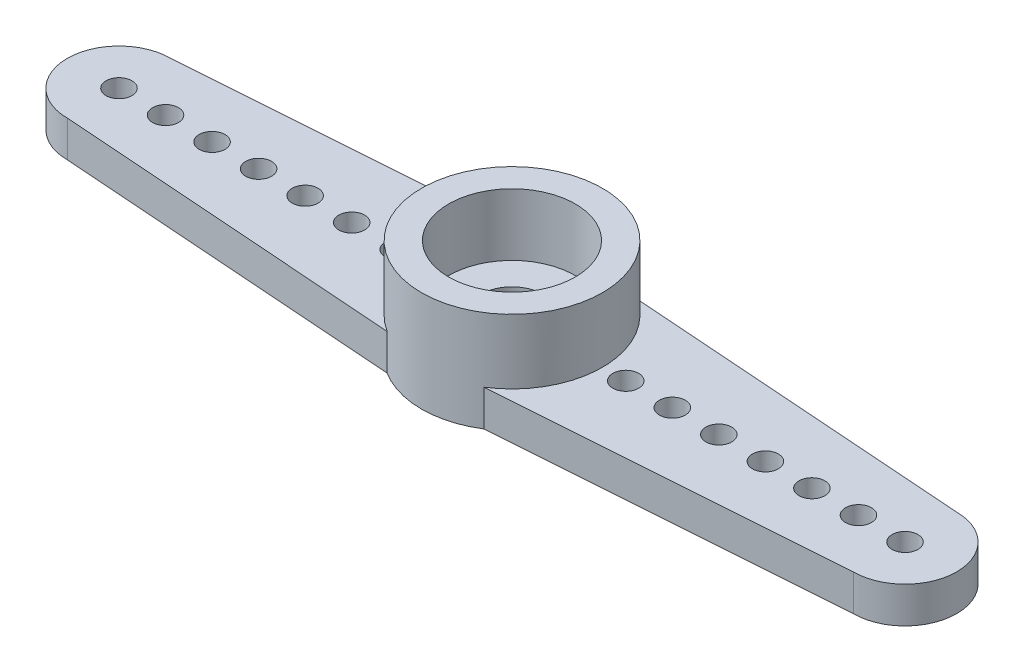
ISO-10303-21;
HEADER;
FILE_DESCRIPTION(('STEP AP214'),'2;1');
FILE_NAME('part.step','',(''),(''),'','','');
FILE_SCHEMA(('AUTOMOTIVE_DESIGN { 1 0 10303 214 1 1 1 1 }'));
ENDSEC;
DATA;
#1=APPLICATION_CONTEXT('core data for automotive mechanical design processes');
#2=APPLICATION_PROTOCOL_DEFINITION('international standard','automotive_design',2000,#1);
#3=PRODUCT_CONTEXT('',#1,'mechanical');
#4=PRODUCT('Part','Part','',(#3));
#5=PRODUCT_RELATED_PRODUCT_CATEGORY('part','',(#4));
#6=PRODUCT_DEFINITION_FORMATION('','',#4);
#7=PRODUCT_DEFINITION_CONTEXT('part definition',#1,'design');
#8=PRODUCT_DEFINITION('design','',#6,#7);
#9=PRODUCT_DEFINITION_SHAPE('','',#8);
#10=(LENGTH_UNIT() NAMED_UNIT(*) SI_UNIT(.MILLI.,.METRE.));
#11=(NAMED_UNIT(*) PLANE_ANGLE_UNIT() SI_UNIT($,.RADIAN.));
#12=(NAMED_UNIT(*) SI_UNIT($,.STERADIAN.) SOLID_ANGLE_UNIT());
#13=UNCERTAINTY_MEASURE_WITH_UNIT(LENGTH_MEASURE(1.E-05),#10,'distance_accuracy_value','');
#14=(GEOMETRIC_REPRESENTATION_CONTEXT(3) GLOBAL_UNCERTAINTY_ASSIGNED_CONTEXT((#13)) GLOBAL_UNIT_ASSIGNED_CONTEXT((#10,
#11,#12)) REPRESENTATION_CONTEXT('',''));
#15=CARTESIAN_POINT('',(0.,0.,0.));
#16=DIRECTION('',(0.,0.,1.));
#17=DIRECTION('',(1.,0.,0.));
#18=AXIS2_PLACEMENT_3D('',#15,#16,#17);
#19=CARTESIAN_POINT('',(-15.2,1.4,0.));
#20=DIRECTION('',(0.,1.,0.));
#21=DIRECTION('',(0.,0.,1.));
#22=AXIS2_PLACEMENT_3D('',#19,#20,#21);
#23=PLANE('',#22);
#24=CARTESIAN_POINT('',(-6.2,1.4,0.));
#25=DIRECTION('',(0.,1.,0.));
#26=DIRECTION('',(0.,0.,1.));
#27=AXIS2_PLACEMENT_3D('',#24,#25,#26);
#28=CIRCLE('',#27,0.500000000000001);
#29=CARTESIAN_POINT('',(-6.2,1.4,0.500000000000001));
#30=VERTEX_POINT('',#29);
#31=EDGE_CURVE('E185',#30,#30,#28,.T.);
#32=ORIENTED_EDGE('',*,*,#31,.F.);
#33=EDGE_LOOP('',(#32));
#34=FACE_BOUND('',#33,.T.);
#35=CARTESIAN_POINT('',(-9.8,1.4,0.));
#36=DIRECTION('',(0.,1.,0.));
#37=DIRECTION('',(0.,0.,1.));
#38=AXIS2_PLACEMENT_3D('',#35,#36,#37);
#39=CIRCLE('',#38,0.500000000000001);
#40=CARTESIAN_POINT('',(-9.8,1.4,0.500000000000001));
#41=VERTEX_POINT('',#40);
#42=EDGE_CURVE('E197',#41,#41,#39,.T.);
#43=ORIENTED_EDGE('',*,*,#42,.F.);
#44=EDGE_LOOP('',(#43));
#45=FACE_BOUND('',#44,.T.);
#46=CARTESIAN_POINT('',(-11.6,1.4,0.));
#47=DIRECTION('',(0.,1.,0.));
#48=DIRECTION('',(0.,0.,1.));
#49=AXIS2_PLACEMENT_3D('',#46,#47,#48);
#50=CIRCLE('',#49,0.499999999999999);
#51=CARTESIAN_POINT('',(-11.6,1.4,0.499999999999999));
#52=VERTEX_POINT('',#51);
#53=EDGE_CURVE('E203',#52,#52,#50,.T.);
#54=ORIENTED_EDGE('',*,*,#53,.F.);
#55=EDGE_LOOP('',(#54));
#56=FACE_BOUND('',#55,.T.);
#57=CARTESIAN_POINT('',(-13.4,1.4,0.));
#58=DIRECTION('',(0.,1.,0.));
#59=DIRECTION('',(0.,0.,1.));
#60=AXIS2_PLACEMENT_3D('',#57,#58,#59);
#61=CIRCLE('',#60,0.500000000000001);
#62=CARTESIAN_POINT('',(-13.4,1.4,0.500000000000001));
#63=VERTEX_POINT('',#62);
#64=EDGE_CURVE('E209',#63,#63,#61,.T.);
#65=ORIENTED_EDGE('',*,*,#64,.F.);
#66=EDGE_LOOP('',(#65));
#67=FACE_BOUND('',#66,.T.);
#68=CARTESIAN_POINT('',(-15.2,1.4,0.));
#69=DIRECTION('',(0.,1.,0.));
#70=DIRECTION('',(0.,0.,1.));
#71=AXIS2_PLACEMENT_3D('',#68,#69,#70);
#72=CIRCLE('',#71,0.500000000000001);
#73=CARTESIAN_POINT('',(-15.2,1.4,0.500000000000001));
#74=VERTEX_POINT('',#73);
#75=EDGE_CURVE('E96',#74,#74,#72,.T.);
#76=ORIENTED_EDGE('',*,*,#75,.F.);
#77=EDGE_LOOP('',(#76));
#78=FACE_BOUND('',#77,.T.);
#79=CARTESIAN_POINT('',(-8.,1.4,0.));
#80=DIRECTION('',(0.,1.,0.));
#81=DIRECTION('',(0.,0.,1.));
#82=AXIS2_PLACEMENT_3D('',#79,#80,#81);
#83=CIRCLE('',#82,0.500000000000001);
#84=CARTESIAN_POINT('',(-8.,1.4,0.500000000000001));
#85=VERTEX_POINT('',#84);
#86=EDGE_CURVE('E191',#85,#85,#83,.T.);
#87=ORIENTED_EDGE('',*,*,#86,.F.);
#88=EDGE_LOOP('',(#87));
#89=FACE_BOUND('',#88,.T.);
#90=CARTESIAN_POINT('',(-4.4,1.4,0.));
#91=DIRECTION('',(0.,1.,0.));
#92=DIRECTION('',(0.,0.,1.));
#93=AXIS2_PLACEMENT_3D('',#90,#91,#92);
#94=CIRCLE('',#93,0.500000000000001);
#95=CARTESIAN_POINT('',(-4.4,1.4,0.500000000000001));
#96=VERTEX_POINT('',#95);
#97=EDGE_CURVE('E179',#96,#96,#94,.T.);
#98=ORIENTED_EDGE('',*,*,#97,.F.);
#99=EDGE_LOOP('',(#98));
#100=FACE_BOUND('',#99,.T.);
#101=DIRECTION('',(0.997420198870011,0.,0.0717840294641297));
#102=VECTOR('',#101,1.);
#103=CARTESIAN_POINT('',(-15.2,1.4,2.));
#104=LINE('',#103,#102);
#105=CARTESIAN_POINT('',(-15.2,1.4,2.));
#106=VERTEX_POINT('',#105);
#107=CARTESIAN_POINT('',(-1.86858471289894,1.4,2.95945791838985));
#108=VERTEX_POINT('',#107);
#109=EDGE_CURVE('E223',#106,#108,#104,.T.);
#110=ORIENTED_EDGE('',*,*,#109,.T.);
#111=CARTESIAN_POINT('',(0.,1.4,0.));
#112=DIRECTION('',(0.,1.,0.));
#113=DIRECTION('',(0.,0.,1.));
#114=AXIS2_PLACEMENT_3D('',#111,#112,#113);
#115=CIRCLE('',#114,3.5);
#116=CARTESIAN_POINT('',(-1.86858471289894,1.4,-2.95945791838985));
#117=VERTEX_POINT('',#116);
#118=EDGE_CURVE('E118',#117,#108,#115,.T.);
#119=ORIENTED_EDGE('',*,*,#118,.F.);
#120=DIRECTION('',(-0.997420198870011,0.,0.0717840294641296));
#121=VECTOR('',#120,1.);
#122=CARTESIAN_POINT('',(-15.2,1.4,-2.));
#123=LINE('',#122,#121);
#124=CARTESIAN_POINT('',(-15.2,1.4,-2.));
#125=VERTEX_POINT('',#124);
#126=EDGE_CURVE('E49',#117,#125,#123,.T.);
#127=ORIENTED_EDGE('',*,*,#126,.T.);
#128=CARTESIAN_POINT('',(-15.2,1.4,0.));
#129=DIRECTION('',(0.,1.,0.));
#130=DIRECTION('',(0.,0.,1.));
#131=AXIS2_PLACEMENT_3D('',#128,#129,#130);
#132=CIRCLE('',#131,2.);
#133=EDGE_CURVE('E82',#125,#106,#132,.T.);
#134=ORIENTED_EDGE('',*,*,#133,.T.);
#135=EDGE_LOOP('',(#110,#119,#127,#134));
#136=FACE_BOUND('',#135,.T.);
#137=ADVANCED_FACE('F32',(#34,#45,#56,#67,#78,#89,#100,#136),#23,.T.);
#138=CARTESIAN_POINT('',(6.2,1.4,0.));
#139=DIRECTION('',(0.,1.,0.));
#140=DIRECTION('',(0.,0.,1.));
#141=AXIS2_PLACEMENT_3D('',#138,#139,#140);
#142=CIRCLE('',#141,0.499999999999997);
#143=CARTESIAN_POINT('',(6.2,1.4,0.500000000000053));
#144=VERTEX_POINT('',#143);
#145=EDGE_CURVE('E149',#144,#144,#142,.T.);
#146=ORIENTED_EDGE('',*,*,#145,.F.);
#147=EDGE_LOOP('',(#146));
#148=FACE_BOUND('',#147,.T.);
#149=CARTESIAN_POINT('',(9.8,1.4,0.));
#150=DIRECTION('',(0.,1.,0.));
#151=DIRECTION('',(0.,0.,1.));
#152=AXIS2_PLACEMENT_3D('',#149,#150,#151);
#153=CIRCLE('',#152,0.499999999999997);
#154=CARTESIAN_POINT('',(9.8,1.4,0.500000000000028));
#155=VERTEX_POINT('',#154);
#156=EDGE_CURVE('E161',#155,#155,#153,.T.);
#157=ORIENTED_EDGE('',*,*,#156,.F.);
#158=EDGE_LOOP('',(#157));
#159=FACE_BOUND('',#158,.T.);
#160=CARTESIAN_POINT('',(13.4,1.4,0.));
#161=DIRECTION('',(0.,1.,0.));
#162=DIRECTION('',(0.,0.,1.));
#163=AXIS2_PLACEMENT_3D('',#160,#161,#162);
#164=CIRCLE('',#163,0.499999999999997);
#165=CARTESIAN_POINT('',(13.4,1.4,0.500000000000003));
#166=VERTEX_POINT('',#165);
#167=EDGE_CURVE('E173',#166,#166,#164,.T.);
#168=ORIENTED_EDGE('',*,*,#167,.F.);
#169=EDGE_LOOP('',(#168));
#170=FACE_BOUND('',#169,.T.);
#171=CARTESIAN_POINT('',(15.2,1.4,0.));
#172=DIRECTION('',(0.,1.,0.));
#173=DIRECTION('',(0.,0.,1.));
#174=AXIS2_PLACEMENT_3D('',#171,#172,#173);
#175=CIRCLE('',#174,0.499999999999997);
#176=CARTESIAN_POINT('',(15.2,1.4,0.49999999999999));
#177=VERTEX_POINT('',#176);
#178=EDGE_CURVE('E215',#177,#177,#175,.T.);
#179=ORIENTED_EDGE('',*,*,#178,.F.);
#180=EDGE_LOOP('',(#179));
#181=FACE_BOUND('',#180,.T.);
#182=CARTESIAN_POINT('',(11.6,1.4,0.));
#183=DIRECTION('',(0.,1.,0.));
#184=DIRECTION('',(0.,0.,1.));
#185=AXIS2_PLACEMENT_3D('',#182,#183,#184);
#186=CIRCLE('',#185,0.499999999999999);
#187=CARTESIAN_POINT('',(11.6,1.4,0.500000000000017));
#188=VERTEX_POINT('',#187);
#189=EDGE_CURVE('E167',#188,#188,#186,.T.);
#190=ORIENTED_EDGE('',*,*,#189,.F.);
#191=EDGE_LOOP('',(#190));
#192=FACE_BOUND('',#191,.T.);
#193=CARTESIAN_POINT('',(8.,1.4,0.));
#194=DIRECTION('',(0.,1.,0.));
#195=DIRECTION('',(0.,0.,1.));
#196=AXIS2_PLACEMENT_3D('',#193,#194,#195);
#197=CIRCLE('',#196,0.499999999999997);
#198=CARTESIAN_POINT('',(8.,1.4,0.500000000000041));
#199=VERTEX_POINT('',#198);
#200=EDGE_CURVE('E155',#199,#199,#197,.T.);
#201=ORIENTED_EDGE('',*,*,#200,.F.);
#202=EDGE_LOOP('',(#201));
#203=FACE_BOUND('',#202,.T.);
#204=CARTESIAN_POINT('',(4.4,1.4,0.));
#205=DIRECTION('',(0.,1.,0.));
#206=DIRECTION('',(0.,0.,1.));
#207=AXIS2_PLACEMENT_3D('',#204,#205,#206);
#208=CIRCLE('',#207,0.499999999999997);
#209=CARTESIAN_POINT('',(4.4,1.4,0.500000000000066));
#210=VERTEX_POINT('',#209);
#211=EDGE_CURVE('E143',#210,#210,#208,.T.);
#212=ORIENTED_EDGE('',*,*,#211,.F.);
#213=EDGE_LOOP('',(#212));
#214=FACE_BOUND('',#213,.T.);
#215=CARTESIAN_POINT('',(1.86858471289894,1.4,2.95945791838985));
#216=VERTEX_POINT('',#215);
#217=CARTESIAN_POINT('',(1.86858471289894,1.4,-2.95945791838985));
#218=VERTEX_POINT('',#217);
#219=EDGE_CURVE('E134',#216,#218,#115,.T.);
#220=ORIENTED_EDGE('',*,*,#219,.F.);
#221=DIRECTION('',(0.997420198870011,0.,-0.0717840294641297));
#222=VECTOR('',#221,1.);
#223=CARTESIAN_POINT('',(-14.9001527327747,1.4,4.16629887091939));
#224=LINE('',#223,#222);
#225=CARTESIAN_POINT('',(15.2,1.4,2.));
#226=VERTEX_POINT('',#225);
#227=EDGE_CURVE('E121',#216,#226,#224,.T.);
#228=ORIENTED_EDGE('',*,*,#227,.T.);
#229=CARTESIAN_POINT('',(15.2,1.4,0.));
#230=DIRECTION('',(0.,1.,0.));
#231=DIRECTION('',(0.,0.,-1.));
#232=AXIS2_PLACEMENT_3D('',#229,#230,#231);
#233=CIRCLE('',#232,2.);
#234=CARTESIAN_POINT('',(15.2,1.4,-2.));
#235=VERTEX_POINT('',#234);
#236=EDGE_CURVE('E225',#226,#235,#233,.T.);
#237=ORIENTED_EDGE('',*,*,#236,.T.);
#238=DIRECTION('',(-0.997420198870011,0.,-0.0717840294641295));
#239=VECTOR('',#238,1.);
#240=CARTESIAN_POINT('',(-14.9001527327747,1.4,-4.16629887091939));
#241=LINE('',#240,#239);
#242=EDGE_CURVE('E126',#235,#218,#241,.T.);
#243=ORIENTED_EDGE('',*,*,#242,.T.);
#244=EDGE_LOOP('',(#220,#228,#237,#243));
#245=FACE_BOUND('',#244,.T.);
#246=ADVANCED_FACE('F233',(#148,#159,#170,#181,#192,#203,#214,#245),#23,.T.);
#247=CARTESIAN_POINT('',(-15.2,0.,0.));
#248=DIRECTION('',(0.,1.,0.));
#249=DIRECTION('',(0.,0.,1.));
#250=AXIS2_PLACEMENT_3D('',#247,#248,#249);
#251=PLANE('',#250);
#252=CARTESIAN_POINT('',(0.,0.,0.));
#253=DIRECTION('',(0.,-1.,0.));
#254=DIRECTION('',(0.,0.,-1.));
#255=AXIS2_PLACEMENT_3D('',#252,#253,#254);
#256=CIRCLE('',#255,2.35);
#257=CARTESIAN_POINT('',(0.,0.,-2.35));
#258=VERTEX_POINT('',#257);
#259=EDGE_CURVE('E133',#258,#258,#256,.T.);
#260=ORIENTED_EDGE('',*,*,#259,.F.);
#261=EDGE_LOOP('',(#260));
#262=FACE_BOUND('',#261,.T.);
#263=CARTESIAN_POINT('',(-15.2,0.,0.));
#264=DIRECTION('',(0.,1.,0.));
#265=DIRECTION('',(0.,0.,1.));
#266=AXIS2_PLACEMENT_3D('',#263,#264,#265);
#267=CIRCLE('',#266,0.500000000000001);
#268=CARTESIAN_POINT('',(-15.2,0.,0.500000000000001));
#269=VERTEX_POINT('',#268);
#270=EDGE_CURVE('E100',#269,#269,#267,.T.);
#271=ORIENTED_EDGE('',*,*,#270,.T.);
#272=EDGE_LOOP('',(#271));
#273=FACE_BOUND('',#272,.T.);
#274=CARTESIAN_POINT('',(15.2,0.,0.));
#275=DIRECTION('',(0.,1.,0.));
#276=DIRECTION('',(0.,0.,1.));
#277=AXIS2_PLACEMENT_3D('',#274,#275,#276);
#278=CIRCLE('',#277,0.499999999999997);
#279=CARTESIAN_POINT('',(15.2,0.,0.49999999999999));
#280=VERTEX_POINT('',#279);
#281=EDGE_CURVE('E212',#280,#280,#278,.T.);
#282=ORIENTED_EDGE('',*,*,#281,.T.);
#283=EDGE_LOOP('',(#282));
#284=FACE_BOUND('',#283,.T.);
#285=CARTESIAN_POINT('',(-13.4,0.,0.));
#286=DIRECTION('',(0.,1.,0.));
#287=DIRECTION('',(0.,0.,1.));
#288=AXIS2_PLACEMENT_3D('',#285,#286,#287);
#289=CIRCLE('',#288,0.500000000000001);
#290=CARTESIAN_POINT('',(-13.4,0.,0.500000000000001));
#291=VERTEX_POINT('',#290);
#292=EDGE_CURVE('E206',#291,#291,#289,.T.);
#293=ORIENTED_EDGE('',*,*,#292,.T.);
#294=EDGE_LOOP('',(#293));
#295=FACE_BOUND('',#294,.T.);
#296=CARTESIAN_POINT('',(-11.6,0.,0.));
#297=DIRECTION('',(0.,1.,0.));
#298=DIRECTION('',(0.,0.,1.));
#299=AXIS2_PLACEMENT_3D('',#296,#297,#298);
#300=CIRCLE('',#299,0.499999999999999);
#301=CARTESIAN_POINT('',(-11.6,0.,0.499999999999999));
#302=VERTEX_POINT('',#301);
#303=EDGE_CURVE('E200',#302,#302,#300,.T.);
#304=ORIENTED_EDGE('',*,*,#303,.T.);
#305=EDGE_LOOP('',(#304));
#306=FACE_BOUND('',#305,.T.);
#307=CARTESIAN_POINT('',(-9.8,0.,0.));
#308=DIRECTION('',(0.,1.,0.));
#309=DIRECTION('',(0.,0.,1.));
#310=AXIS2_PLACEMENT_3D('',#307,#308,#309);
#311=CIRCLE('',#310,0.500000000000001);
#312=CARTESIAN_POINT('',(-9.8,0.,0.500000000000001));
#313=VERTEX_POINT('',#312);
#314=EDGE_CURVE('E194',#313,#313,#311,.T.);
#315=ORIENTED_EDGE('',*,*,#314,.T.);
#316=EDGE_LOOP('',(#315));
#317=FACE_BOUND('',#316,.T.);
#318=CARTESIAN_POINT('',(-8.,0.,0.));
#319=DIRECTION('',(0.,1.,0.));
#320=DIRECTION('',(0.,0.,1.));
#321=AXIS2_PLACEMENT_3D('',#318,#319,#320);
#322=CIRCLE('',#321,0.500000000000001);
#323=CARTESIAN_POINT('',(-8.,0.,0.500000000000001));
#324=VERTEX_POINT('',#323);
#325=EDGE_CURVE('E188',#324,#324,#322,.T.);
#326=ORIENTED_EDGE('',*,*,#325,.T.);
#327=EDGE_LOOP('',(#326));
#328=FACE_BOUND('',#327,.T.);
#329=CARTESIAN_POINT('',(-6.2,0.,0.));
#330=DIRECTION('',(0.,1.,0.));
#331=DIRECTION('',(0.,0.,1.));
#332=AXIS2_PLACEMENT_3D('',#329,#330,#331);
#333=CIRCLE('',#332,0.500000000000001);
#334=CARTESIAN_POINT('',(-6.2,0.,0.500000000000001));
#335=VERTEX_POINT('',#334);
#336=EDGE_CURVE('E182',#335,#335,#333,.T.);
#337=ORIENTED_EDGE('',*,*,#336,.T.);
#338=EDGE_LOOP('',(#337));
#339=FACE_BOUND('',#338,.T.);
#340=CARTESIAN_POINT('',(-4.4,0.,0.));
#341=DIRECTION('',(0.,1.,0.));
#342=DIRECTION('',(0.,0.,1.));
#343=AXIS2_PLACEMENT_3D('',#340,#341,#342);
#344=CIRCLE('',#343,0.500000000000001);
#345=CARTESIAN_POINT('',(-4.4,0.,0.500000000000001));
#346=VERTEX_POINT('',#345);
#347=EDGE_CURVE('E176',#346,#346,#344,.T.);
#348=ORIENTED_EDGE('',*,*,#347,.T.);
#349=EDGE_LOOP('',(#348));
#350=FACE_BOUND('',#349,.T.);
#351=CARTESIAN_POINT('',(13.4,0.,0.));
#352=DIRECTION('',(0.,1.,0.));
#353=DIRECTION('',(0.,0.,1.));
#354=AXIS2_PLACEMENT_3D('',#351,#352,#353);
#355=CIRCLE('',#354,0.499999999999997);
#356=CARTESIAN_POINT('',(13.4,0.,0.500000000000003));
#357=VERTEX_POINT('',#356);
#358=EDGE_CURVE('E170',#357,#357,#355,.T.);
#359=ORIENTED_EDGE('',*,*,#358,.T.);
#360=EDGE_LOOP('',(#359));
#361=FACE_BOUND('',#360,.T.);
#362=CARTESIAN_POINT('',(11.6,0.,0.));
#363=DIRECTION('',(0.,1.,0.));
#364=DIRECTION('',(0.,0.,1.));
#365=AXIS2_PLACEMENT_3D('',#362,#363,#364);
#366=CIRCLE('',#365,0.499999999999999);
#367=CARTESIAN_POINT('',(11.6,0.,0.500000000000017));
#368=VERTEX_POINT('',#367);
#369=EDGE_CURVE('E164',#368,#368,#366,.T.);
#370=ORIENTED_EDGE('',*,*,#369,.T.);
#371=EDGE_LOOP('',(#370));
#372=FACE_BOUND('',#371,.T.);
#373=CARTESIAN_POINT('',(9.8,0.,0.));
#374=DIRECTION('',(0.,1.,0.));
#375=DIRECTION('',(0.,0.,1.));
#376=AXIS2_PLACEMENT_3D('',#373,#374,#375);
#377=CIRCLE('',#376,0.499999999999997);
#378=CARTESIAN_POINT('',(9.8,0.,0.500000000000028));
#379=VERTEX_POINT('',#378);
#380=EDGE_CURVE('E158',#379,#379,#377,.T.);
#381=ORIENTED_EDGE('',*,*,#380,.T.);
#382=EDGE_LOOP('',(#381));
#383=FACE_BOUND('',#382,.T.);
#384=CARTESIAN_POINT('',(8.,0.,0.));
#385=DIRECTION('',(0.,1.,0.));
#386=DIRECTION('',(0.,0.,1.));
#387=AXIS2_PLACEMENT_3D('',#384,#385,#386);
#388=CIRCLE('',#387,0.499999999999997);
#389=CARTESIAN_POINT('',(8.,0.,0.500000000000041));
#390=VERTEX_POINT('',#389);
#391=EDGE_CURVE('E152',#390,#390,#388,.T.);
#392=ORIENTED_EDGE('',*,*,#391,.T.);
#393=EDGE_LOOP('',(#392));
#394=FACE_BOUND('',#393,.T.);
#395=CARTESIAN_POINT('',(6.2,0.,0.));
#396=DIRECTION('',(0.,1.,0.));
#397=DIRECTION('',(0.,0.,1.));
#398=AXIS2_PLACEMENT_3D('',#395,#396,#397);
#399=CIRCLE('',#398,0.499999999999997);
#400=CARTESIAN_POINT('',(6.2,0.,0.500000000000053));
#401=VERTEX_POINT('',#400);
#402=EDGE_CURVE('E146',#401,#401,#399,.T.);
#403=ORIENTED_EDGE('',*,*,#402,.T.);
#404=EDGE_LOOP('',(#403));
#405=FACE_BOUND('',#404,.T.);
#406=CARTESIAN_POINT('',(4.4,0.,0.));
#407=DIRECTION('',(0.,1.,0.));
#408=DIRECTION('',(0.,0.,1.));
#409=AXIS2_PLACEMENT_3D('',#406,#407,#408);
#410=CIRCLE('',#409,0.499999999999997);
#411=CARTESIAN_POINT('',(4.4,0.,0.500000000000066));
#412=VERTEX_POINT('',#411);
#413=EDGE_CURVE('E140',#412,#412,#410,.T.);
#414=ORIENTED_EDGE('',*,*,#413,.T.);
#415=EDGE_LOOP('',(#414));
#416=FACE_BOUND('',#415,.T.);
#417=CARTESIAN_POINT('',(0.,0.,0.));
#418=DIRECTION('',(0.,-1.,0.));
#419=DIRECTION('',(0.,0.,-1.));
#420=AXIS2_PLACEMENT_3D('',#417,#418,#419);
#421=CIRCLE('',#420,3.5);
#422=CARTESIAN_POINT('',(1.86858471289894,0.,2.95945791838985));
#423=VERTEX_POINT('',#422);
#424=CARTESIAN_POINT('',(-1.86858471289894,0.,2.95945791838985));
#425=VERTEX_POINT('',#424);
#426=EDGE_CURVE('E255',#423,#425,#421,.T.);
#427=ORIENTED_EDGE('',*,*,#426,.T.);
#428=DIRECTION('',(0.997420198870011,0.,0.0717840294641297));
#429=VECTOR('',#428,1.);
#430=CARTESIAN_POINT('',(-15.2,0.,2.));
#431=LINE('',#430,#429);
#432=CARTESIAN_POINT('',(-15.2,0.,2.));
#433=VERTEX_POINT('',#432);
#434=EDGE_CURVE('E94',#433,#425,#431,.T.);
#435=ORIENTED_EDGE('',*,*,#434,.F.);
#436=CARTESIAN_POINT('',(-15.2,0.,0.));
#437=DIRECTION('',(0.,1.,0.));
#438=DIRECTION('',(0.,0.,1.));
#439=AXIS2_PLACEMENT_3D('',#436,#437,#438);
#440=CIRCLE('',#439,2.);
#441=CARTESIAN_POINT('',(-15.2,0.,-2.));
#442=VERTEX_POINT('',#441);
#443=EDGE_CURVE('E88',#442,#433,#440,.T.);
#444=ORIENTED_EDGE('',*,*,#443,.F.);
#445=DIRECTION('',(-0.997420198870011,0.,0.0717840294641296));
#446=VECTOR('',#445,1.);
#447=CARTESIAN_POINT('',(-15.2,0.,-2.));
#448=LINE('',#447,#446);
#449=CARTESIAN_POINT('',(-1.86858471289894,0.,-2.95945791838985));
#450=VERTEX_POINT('',#449);
#451=EDGE_CURVE('E70',#450,#442,#448,.T.);
#452=ORIENTED_EDGE('',*,*,#451,.F.);
#453=CARTESIAN_POINT('',(0.,0.,0.));
#454=DIRECTION('',(0.,-1.,0.));
#455=DIRECTION('',(0.,0.,-1.));
#456=AXIS2_PLACEMENT_3D('',#453,#454,#455);
#457=CIRCLE('',#456,3.5);
#458=CARTESIAN_POINT('',(1.86858471289894,0.,-2.95945791838985));
#459=VERTEX_POINT('',#458);
#460=EDGE_CURVE('E253',#450,#459,#457,.T.);
#461=ORIENTED_EDGE('',*,*,#460,.T.);
#462=DIRECTION('',(0.997420198870011,0.,0.0717840294641295));
#463=VECTOR('',#462,1.);
#464=CARTESIAN_POINT('',(1.86858471289894,0.,-2.95945791838985));
#465=LINE('',#464,#463);
#466=CARTESIAN_POINT('',(15.2,0.,-2.));
#467=VERTEX_POINT('',#466);
#468=EDGE_CURVE('E250',#459,#467,#465,.T.);
#469=ORIENTED_EDGE('',*,*,#468,.T.);
#470=CARTESIAN_POINT('',(15.2,0.,0.));
#471=DIRECTION('',(0.,1.,0.));
#472=DIRECTION('',(0.,0.,-1.));
#473=AXIS2_PLACEMENT_3D('',#470,#471,#472);
#474=CIRCLE('',#473,2.);
#475=CARTESIAN_POINT('',(15.2,0.,1.99999999999999));
#476=VERTEX_POINT('',#475);
#477=EDGE_CURVE('E83',#476,#467,#474,.T.);
#478=ORIENTED_EDGE('',*,*,#477,.F.);
#479=DIRECTION('',(-0.997420198870011,0.,0.0717840294641296));
#480=VECTOR('',#479,1.);
#481=CARTESIAN_POINT('',(15.2,0.,2.));
#482=LINE('',#481,#480);
#483=EDGE_CURVE('E64',#476,#423,#482,.T.);
#484=ORIENTED_EDGE('',*,*,#483,.T.);
#485=EDGE_LOOP('',(#427,#435,#444,#452,#461,#469,#478,#484));
#486=FACE_BOUND('',#485,.T.);
#487=ADVANCED_FACE('F92',(#262,#273,#284,#295,#306,#317,#328,#339,#350,#361,#372,#383,#394,#405,
#416,#486),#251,.F.);
#488=CARTESIAN_POINT('',(-15.2,1.4,0.));
#489=DIRECTION('',(0.,-1.,0.));
#490=DIRECTION('',(0.,0.,-1.));
#491=AXIS2_PLACEMENT_3D('',#488,#489,#490);
#492=CYLINDRICAL_SURFACE('',#491,2.);
#493=ORIENTED_EDGE('',*,*,#443,.T.);
#494=DIRECTION('',(0.,-1.,0.));
#495=VECTOR('',#494,1.);
#496=CARTESIAN_POINT('',(-15.2,1.4,2.));
#497=LINE('',#496,#495);
#498=EDGE_CURVE('E41',#106,#433,#497,.T.);
#499=ORIENTED_EDGE('',*,*,#498,.F.);
#500=ORIENTED_EDGE('',*,*,#133,.F.);
#501=DIRECTION('',(0.,-1.,0.));
#502=VECTOR('',#501,1.);
#503=CARTESIAN_POINT('',(-15.2,1.4,-2.));
#504=LINE('',#503,#502);
#505=EDGE_CURVE('E73',#125,#442,#504,.T.);
#506=ORIENTED_EDGE('',*,*,#505,.T.);
#507=EDGE_LOOP('',(#493,#499,#500,#506));
#508=FACE_BOUND('',#507,.T.);
#509=ADVANCED_FACE('F34',(#508),#492,.T.);
#510=CARTESIAN_POINT('',(-15.2,1.4,2.));
#511=DIRECTION('',(0.0717840294641297,0.,-0.997420198870011));
#512=DIRECTION('',(-0.997420198870011,0.,-0.0717840294641297));
#513=AXIS2_PLACEMENT_3D('',#510,#511,#512);
#514=PLANE('',#513);
#515=ORIENTED_EDGE('',*,*,#434,.T.);
#516=DIRECTION('',(0.,-1.,0.));
#517=VECTOR('',#516,1.);
#518=CARTESIAN_POINT('',(-1.86858471289894,3.9,2.95945791838985));
#519=LINE('',#518,#517);
#520=EDGE_CURVE('E260',#108,#425,#519,.T.);
#521=ORIENTED_EDGE('',*,*,#520,.F.);
#522=ORIENTED_EDGE('',*,*,#109,.F.);
#523=ORIENTED_EDGE('',*,*,#498,.T.);
#524=EDGE_LOOP('',(#515,#521,#522,#523));
#525=FACE_BOUND('',#524,.T.);
#526=ADVANCED_FACE('F281',(#525),#514,.F.);
#527=CARTESIAN_POINT('',(15.2,1.4,0.));
#528=DIRECTION('',(0.,-1.,0.));
#529=DIRECTION('',(0.,0.,-1.));
#530=AXIS2_PLACEMENT_3D('',#527,#528,#529);
#531=CYLINDRICAL_SURFACE('',#530,2.);
#532=ORIENTED_EDGE('',*,*,#477,.T.);
#533=DIRECTION('',(0.,-1.,0.));
#534=VECTOR('',#533,1.);
#535=CARTESIAN_POINT('',(15.2,1.4,-2.00000000000001));
#536=LINE('',#535,#534);
#537=EDGE_CURVE('E89',#235,#467,#536,.T.);
#538=ORIENTED_EDGE('',*,*,#537,.F.);
#539=ORIENTED_EDGE('',*,*,#236,.F.);
#540=DIRECTION('',(0.,-1.,0.));
#541=VECTOR('',#540,1.);
#542=CARTESIAN_POINT('',(15.2,1.4,1.99999999999999));
#543=LINE('',#542,#541);
#544=EDGE_CURVE('E109',#226,#476,#543,.T.);
#545=ORIENTED_EDGE('',*,*,#544,.T.);
#546=EDGE_LOOP('',(#532,#538,#539,#545));
#547=FACE_BOUND('',#546,.T.);
#548=ADVANCED_FACE('F241',(#547),#531,.T.);
#549=CARTESIAN_POINT('',(-15.2,1.4,-2.));
#550=DIRECTION('',(0.0717840294641296,0.,0.997420198870011));
#551=DIRECTION('',(0.997420198870011,0.,-0.0717840294641296));
#552=AXIS2_PLACEMENT_3D('',#549,#550,#551);
#553=PLANE('',#552);
#554=ORIENTED_EDGE('',*,*,#451,.T.);
#555=ORIENTED_EDGE('',*,*,#505,.F.);
#556=ORIENTED_EDGE('',*,*,#126,.F.);
#557=DIRECTION('',(0.,-1.,0.));
#558=VECTOR('',#557,1.);
#559=CARTESIAN_POINT('',(-1.86858471289894,3.9,-2.95945791838985));
#560=LINE('',#559,#558);
#561=EDGE_CURVE('E77',#117,#450,#560,.T.);
#562=ORIENTED_EDGE('',*,*,#561,.T.);
#563=EDGE_LOOP('',(#554,#555,#556,#562));
#564=FACE_BOUND('',#563,.T.);
#565=ADVANCED_FACE('F72',(#564),#553,.F.);
#566=CARTESIAN_POINT('',(-15.2,1.4,0.));
#567=DIRECTION('',(0.,-1.,0.));
#568=DIRECTION('',(0.,0.,-1.));
#569=AXIS2_PLACEMENT_3D('',#566,#567,#568);
#570=CYLINDRICAL_SURFACE('',#569,0.500000000000001);
#571=ORIENTED_EDGE('',*,*,#75,.T.);
#572=EDGE_LOOP('',(#571));
#573=FACE_BOUND('',#572,.T.);
#574=ORIENTED_EDGE('',*,*,#270,.F.);
#575=EDGE_LOOP('',(#574));
#576=FACE_BOUND('',#575,.T.);
#577=ADVANCED_FACE('F306',(#573,#576),#570,.F.);
#578=CARTESIAN_POINT('',(15.2,1.4,0.));
#579=DIRECTION('',(0.,-1.,0.));
#580=DIRECTION('',(0.,0.,-1.));
#581=AXIS2_PLACEMENT_3D('',#578,#579,#580);
#582=CYLINDRICAL_SURFACE('',#581,0.499999999999997);
#583=ORIENTED_EDGE('',*,*,#178,.T.);
#584=EDGE_LOOP('',(#583));
#585=FACE_BOUND('',#584,.T.);
#586=ORIENTED_EDGE('',*,*,#281,.F.);
#587=EDGE_LOOP('',(#586));
#588=FACE_BOUND('',#587,.T.);
#589=ADVANCED_FACE('F508',(#585,#588),#582,.F.);
#590=CARTESIAN_POINT('',(-13.4,1.4,0.));
#591=DIRECTION('',(0.,-1.,0.));
#592=DIRECTION('',(0.,0.,-1.));
#593=AXIS2_PLACEMENT_3D('',#590,#591,#592);
#594=CYLINDRICAL_SURFACE('',#593,0.500000000000001);
#595=ORIENTED_EDGE('',*,*,#64,.T.);
#596=EDGE_LOOP('',(#595));
#597=FACE_BOUND('',#596,.T.);
#598=ORIENTED_EDGE('',*,*,#292,.F.);
#599=EDGE_LOOP('',(#598));
#600=FACE_BOUND('',#599,.T.);
#601=ADVANCED_FACE('F498',(#597,#600),#594,.F.);
#602=CARTESIAN_POINT('',(-11.6,1.4,0.));
#603=DIRECTION('',(0.,-1.,0.));
#604=DIRECTION('',(0.,0.,-1.));
#605=AXIS2_PLACEMENT_3D('',#602,#603,#604);
#606=CYLINDRICAL_SURFACE('',#605,0.499999999999999);
#607=ORIENTED_EDGE('',*,*,#53,.T.);
#608=EDGE_LOOP('',(#607));
#609=FACE_BOUND('',#608,.T.);
#610=ORIENTED_EDGE('',*,*,#303,.F.);
#611=EDGE_LOOP('',(#610));
#612=FACE_BOUND('',#611,.T.);
#613=ADVANCED_FACE('F488',(#609,#612),#606,.F.);
#614=CARTESIAN_POINT('',(-9.8,1.4,0.));
#615=DIRECTION('',(0.,-1.,0.));
#616=DIRECTION('',(0.,0.,-1.));
#617=AXIS2_PLACEMENT_3D('',#614,#615,#616);
#618=CYLINDRICAL_SURFACE('',#617,0.500000000000001);
#619=ORIENTED_EDGE('',*,*,#42,.T.);
#620=EDGE_LOOP('',(#619));
#621=FACE_BOUND('',#620,.T.);
#622=ORIENTED_EDGE('',*,*,#314,.F.);
#623=EDGE_LOOP('',(#622));
#624=FACE_BOUND('',#623,.T.);
#625=ADVANCED_FACE('F478',(#621,#624),#618,.F.);
#626=CARTESIAN_POINT('',(-8.,1.4,0.));
#627=DIRECTION('',(0.,-1.,0.));
#628=DIRECTION('',(0.,0.,-1.));
#629=AXIS2_PLACEMENT_3D('',#626,#627,#628);
#630=CYLINDRICAL_SURFACE('',#629,0.500000000000001);
#631=ORIENTED_EDGE('',*,*,#86,.T.);
#632=EDGE_LOOP('',(#631));
#633=FACE_BOUND('',#632,.T.);
#634=ORIENTED_EDGE('',*,*,#325,.F.);
#635=EDGE_LOOP('',(#634));
#636=FACE_BOUND('',#635,.T.);
#637=ADVANCED_FACE('F468',(#633,#636),#630,.F.);
#638=CARTESIAN_POINT('',(-6.2,1.4,0.));
#639=DIRECTION('',(0.,-1.,0.));
#640=DIRECTION('',(0.,0.,-1.));
#641=AXIS2_PLACEMENT_3D('',#638,#639,#640);
#642=CYLINDRICAL_SURFACE('',#641,0.500000000000001);
#643=ORIENTED_EDGE('',*,*,#31,.T.);
#644=EDGE_LOOP('',(#643));
#645=FACE_BOUND('',#644,.T.);
#646=ORIENTED_EDGE('',*,*,#336,.F.);
#647=EDGE_LOOP('',(#646));
#648=FACE_BOUND('',#647,.T.);
#649=ADVANCED_FACE('F458',(#645,#648),#642,.F.);
#650=CARTESIAN_POINT('',(-4.4,1.4,0.));
#651=DIRECTION('',(0.,-1.,0.));
#652=DIRECTION('',(0.,0.,-1.));
#653=AXIS2_PLACEMENT_3D('',#650,#651,#652);
#654=CYLINDRICAL_SURFACE('',#653,0.500000000000001);
#655=ORIENTED_EDGE('',*,*,#97,.T.);
#656=EDGE_LOOP('',(#655));
#657=FACE_BOUND('',#656,.T.);
#658=ORIENTED_EDGE('',*,*,#347,.F.);
#659=EDGE_LOOP('',(#658));
#660=FACE_BOUND('',#659,.T.);
#661=ADVANCED_FACE('F448',(#657,#660),#654,.F.);
#662=CARTESIAN_POINT('',(13.4,1.4,0.));
#663=DIRECTION('',(0.,-1.,0.));
#664=DIRECTION('',(0.,0.,-1.));
#665=AXIS2_PLACEMENT_3D('',#662,#663,#664);
#666=CYLINDRICAL_SURFACE('',#665,0.499999999999997);
#667=ORIENTED_EDGE('',*,*,#167,.T.);
#668=EDGE_LOOP('',(#667));
#669=FACE_BOUND('',#668,.T.);
#670=ORIENTED_EDGE('',*,*,#358,.F.);
#671=EDGE_LOOP('',(#670));
#672=FACE_BOUND('',#671,.T.);
#673=ADVANCED_FACE('F438',(#669,#672),#666,.F.);
#674=CARTESIAN_POINT('',(11.6,1.4,0.));
#675=DIRECTION('',(0.,-1.,0.));
#676=DIRECTION('',(0.,0.,-1.));
#677=AXIS2_PLACEMENT_3D('',#674,#675,#676);
#678=CYLINDRICAL_SURFACE('',#677,0.499999999999999);
#679=ORIENTED_EDGE('',*,*,#189,.T.);
#680=EDGE_LOOP('',(#679));
#681=FACE_BOUND('',#680,.T.);
#682=ORIENTED_EDGE('',*,*,#369,.F.);
#683=EDGE_LOOP('',(#682));
#684=FACE_BOUND('',#683,.T.);
#685=ADVANCED_FACE('F428',(#681,#684),#678,.F.);
#686=CARTESIAN_POINT('',(9.8,1.4,0.));
#687=DIRECTION('',(0.,-1.,0.));
#688=DIRECTION('',(0.,0.,-1.));
#689=AXIS2_PLACEMENT_3D('',#686,#687,#688);
#690=CYLINDRICAL_SURFACE('',#689,0.499999999999997);
#691=ORIENTED_EDGE('',*,*,#156,.T.);
#692=EDGE_LOOP('',(#691));
#693=FACE_BOUND('',#692,.T.);
#694=ORIENTED_EDGE('',*,*,#380,.F.);
#695=EDGE_LOOP('',(#694));
#696=FACE_BOUND('',#695,.T.);
#697=ADVANCED_FACE('F418',(#693,#696),#690,.F.);
#698=CARTESIAN_POINT('',(8.,1.4,0.));
#699=DIRECTION('',(0.,-1.,0.));
#700=DIRECTION('',(0.,0.,-1.));
#701=AXIS2_PLACEMENT_3D('',#698,#699,#700);
#702=CYLINDRICAL_SURFACE('',#701,0.499999999999997);
#703=ORIENTED_EDGE('',*,*,#200,.T.);
#704=EDGE_LOOP('',(#703));
#705=FACE_BOUND('',#704,.T.);
#706=ORIENTED_EDGE('',*,*,#391,.F.);
#707=EDGE_LOOP('',(#706));
#708=FACE_BOUND('',#707,.T.);
#709=ADVANCED_FACE('F408',(#705,#708),#702,.F.);
#710=CARTESIAN_POINT('',(6.2,1.4,0.));
#711=DIRECTION('',(0.,-1.,0.));
#712=DIRECTION('',(0.,0.,-1.));
#713=AXIS2_PLACEMENT_3D('',#710,#711,#712);
#714=CYLINDRICAL_SURFACE('',#713,0.499999999999997);
#715=ORIENTED_EDGE('',*,*,#145,.T.);
#716=EDGE_LOOP('',(#715));
#717=FACE_BOUND('',#716,.T.);
#718=ORIENTED_EDGE('',*,*,#402,.F.);
#719=EDGE_LOOP('',(#718));
#720=FACE_BOUND('',#719,.T.);
#721=ADVANCED_FACE('F398',(#717,#720),#714,.F.);
#722=CARTESIAN_POINT('',(4.4,1.4,0.));
#723=DIRECTION('',(0.,-1.,0.));
#724=DIRECTION('',(0.,0.,-1.));
#725=AXIS2_PLACEMENT_3D('',#722,#723,#724);
#726=CYLINDRICAL_SURFACE('',#725,0.499999999999997);
#727=ORIENTED_EDGE('',*,*,#211,.T.);
#728=EDGE_LOOP('',(#727));
#729=FACE_BOUND('',#728,.T.);
#730=ORIENTED_EDGE('',*,*,#413,.F.);
#731=EDGE_LOOP('',(#730));
#732=FACE_BOUND('',#731,.T.);
#733=ADVANCED_FACE('F388',(#729,#732),#726,.F.);
#734=CARTESIAN_POINT('',(0.,1.,0.));
#735=DIRECTION('',(0.,-1.,0.));
#736=DIRECTION('',(0.,0.,-1.));
#737=AXIS2_PLACEMENT_3D('',#734,#735,#736);
#738=CYLINDRICAL_SURFACE('',#737,2.35);
#739=CARTESIAN_POINT('',(0.,1.,0.));
#740=DIRECTION('',(0.,-1.,0.));
#741=DIRECTION('',(0.,0.,-1.));
#742=AXIS2_PLACEMENT_3D('',#739,#740,#741);
#743=CIRCLE('',#742,2.35);
#744=CARTESIAN_POINT('',(0.,1.,-2.35));
#745=VERTEX_POINT('',#744);
#746=EDGE_CURVE('E137',#745,#745,#743,.T.);
#747=ORIENTED_EDGE('',*,*,#746,.F.);
#748=EDGE_LOOP('',(#747));
#749=FACE_BOUND('',#748,.T.);
#750=ORIENTED_EDGE('',*,*,#259,.T.);
#751=EDGE_LOOP('',(#750));
#752=FACE_BOUND('',#751,.T.);
#753=ADVANCED_FACE('F376',(#749,#752),#738,.F.);
#754=CARTESIAN_POINT('',(0.,1.,0.));
#755=DIRECTION('',(0.,-1.,0.));
#756=DIRECTION('',(0.,0.,-1.));
#757=AXIS2_PLACEMENT_3D('',#754,#755,#756);
#758=PLANE('',#757);
#759=CARTESIAN_POINT('',(0.,1.,0.));
#760=DIRECTION('',(0.,-1.,0.));
#761=DIRECTION('',(0.,0.,-1.));
#762=AXIS2_PLACEMENT_3D('',#759,#760,#761);
#763=CIRCLE('',#762,1.2);
#764=CARTESIAN_POINT('',(0.,1.,-1.2));
#765=VERTEX_POINT('',#764);
#766=EDGE_CURVE('E111',#765,#765,#763,.T.);
#767=ORIENTED_EDGE('',*,*,#766,.F.);
#768=EDGE_LOOP('',(#767));
#769=FACE_BOUND('',#768,.T.);
#770=ORIENTED_EDGE('',*,*,#746,.T.);
#771=EDGE_LOOP('',(#770));
#772=FACE_BOUND('',#771,.T.);
#773=ADVANCED_FACE('F370',(#769,#772),#758,.T.);
#774=CARTESIAN_POINT('',(0.,3.9,0.));
#775=DIRECTION('',(0.,1.,0.));
#776=DIRECTION('',(0.,0.,1.));
#777=AXIS2_PLACEMENT_3D('',#774,#775,#776);
#778=PLANE('',#777);
#779=CARTESIAN_POINT('',(0.,3.9,0.));
#780=DIRECTION('',(0.,1.,0.));
#781=DIRECTION('',(0.,0.,1.));
#782=AXIS2_PLACEMENT_3D('',#779,#780,#781);
#783=CIRCLE('',#782,3.5);
#784=CARTESIAN_POINT('',(0.,3.9,3.5));
#785=VERTEX_POINT('',#784);
#786=EDGE_CURVE('E130',#785,#785,#783,.T.);
#787=ORIENTED_EDGE('',*,*,#786,.T.);
#788=EDGE_LOOP('',(#787));
#789=FACE_BOUND('',#788,.T.);
#790=CARTESIAN_POINT('',(0.,3.9,0.));
#791=DIRECTION('',(0.,1.,0.));
#792=DIRECTION('',(0.,0.,1.));
#793=AXIS2_PLACEMENT_3D('',#790,#791,#792);
#794=CIRCLE('',#793,2.45);
#795=CARTESIAN_POINT('',(0.,3.9,2.45));
#796=VERTEX_POINT('',#795);
#797=EDGE_CURVE('E113',#796,#796,#794,.T.);
#798=ORIENTED_EDGE('',*,*,#797,.F.);
#799=EDGE_LOOP('',(#798));
#800=FACE_BOUND('',#799,.T.);
#801=ADVANCED_FACE('F375',(#789,#800),#778,.T.);
#802=CARTESIAN_POINT('',(0.,3.9,0.));
#803=DIRECTION('',(0.,-1.,0.));
#804=DIRECTION('',(0.,0.,-1.));
#805=AXIS2_PLACEMENT_3D('',#802,#803,#804);
#806=CYLINDRICAL_SURFACE('',#805,3.5);
#807=ORIENTED_EDGE('',*,*,#118,.T.);
#808=ORIENTED_EDGE('',*,*,#520,.T.);
#809=ORIENTED_EDGE('',*,*,#426,.F.);
#810=DIRECTION('',(0.,-1.,0.));
#811=VECTOR('',#810,1.);
#812=CARTESIAN_POINT('',(1.86858471289894,3.9,2.95945791838985));
#813=LINE('',#812,#811);
#814=EDGE_CURVE('E263',#216,#423,#813,.T.);
#815=ORIENTED_EDGE('',*,*,#814,.F.);
#816=ORIENTED_EDGE('',*,*,#219,.T.);
#817=DIRECTION('',(0.,-1.,0.));
#818=VECTOR('',#817,1.);
#819=CARTESIAN_POINT('',(1.86858471289894,3.9,-2.95945791838985));
#820=LINE('',#819,#818);
#821=EDGE_CURVE('E265',#218,#459,#820,.T.);
#822=ORIENTED_EDGE('',*,*,#821,.T.);
#823=ORIENTED_EDGE('',*,*,#460,.F.);
#824=ORIENTED_EDGE('',*,*,#561,.F.);
#825=EDGE_LOOP('',(#807,#808,#809,#815,#816,#822,#823,#824));
#826=FACE_BOUND('',#825,.T.);
#827=ORIENTED_EDGE('',*,*,#786,.F.);
#828=EDGE_LOOP('',(#827));
#829=FACE_BOUND('',#828,.T.);
#830=ADVANCED_FACE('F270',(#826,#829),#806,.T.);
#831=CARTESIAN_POINT('',(0.,3.9,0.));
#832=DIRECTION('',(0.,-1.,0.));
#833=DIRECTION('',(0.,0.,-1.));
#834=AXIS2_PLACEMENT_3D('',#831,#832,#833);
#835=CYLINDRICAL_SURFACE('',#834,2.45);
#836=CARTESIAN_POINT('',(0.,1.5,0.));
#837=DIRECTION('',(0.,1.,0.));
#838=DIRECTION('',(0.,0.,1.));
#839=AXIS2_PLACEMENT_3D('',#836,#837,#838);
#840=CIRCLE('',#839,2.45);
#841=CARTESIAN_POINT('',(0.,1.5,2.45));
#842=VERTEX_POINT('',#841);
#843=EDGE_CURVE('E11',#842,#842,#840,.T.);
#844=ORIENTED_EDGE('',*,*,#843,.F.);
#845=EDGE_LOOP('',(#844));
#846=FACE_BOUND('',#845,.T.);
#847=ORIENTED_EDGE('',*,*,#797,.T.);
#848=EDGE_LOOP('',(#847));
#849=FACE_BOUND('',#848,.T.);
#850=ADVANCED_FACE('F353',(#846,#849),#835,.F.);
#851=CARTESIAN_POINT('',(0.,0.,0.));
#852=DIRECTION('',(0.,1.,0.));
#853=DIRECTION('',(0.,0.,1.));
#854=AXIS2_PLACEMENT_3D('',#851,#852,#853);
#855=CYLINDRICAL_SURFACE('',#854,1.2);
#856=ORIENTED_EDGE('',*,*,#766,.T.);
#857=EDGE_LOOP('',(#856));
#858=FACE_BOUND('',#857,.T.);
#859=CARTESIAN_POINT('',(0.,1.5,0.));
#860=DIRECTION('',(0.,1.,0.));
#861=DIRECTION('',(0.,0.,1.));
#862=AXIS2_PLACEMENT_3D('',#859,#860,#861);
#863=CIRCLE('',#862,1.2);
#864=CARTESIAN_POINT('',(0.,1.5,1.2));
#865=VERTEX_POINT('',#864);
#866=EDGE_CURVE('E114',#865,#865,#863,.T.);
#867=ORIENTED_EDGE('',*,*,#866,.T.);
#868=EDGE_LOOP('',(#867));
#869=FACE_BOUND('',#868,.T.);
#870=ADVANCED_FACE('F343',(#858,#869),#855,.F.);
#871=CARTESIAN_POINT('',(0.,1.5,0.));
#872=DIRECTION('',(0.,1.,0.));
#873=DIRECTION('',(0.,0.,1.));
#874=AXIS2_PLACEMENT_3D('',#871,#872,#873);
#875=PLANE('',#874);
#876=ORIENTED_EDGE('',*,*,#843,.T.);
#877=EDGE_LOOP('',(#876));
#878=FACE_BOUND('',#877,.T.);
#879=ORIENTED_EDGE('',*,*,#866,.F.);
#880=EDGE_LOOP('',(#879));
#881=FACE_BOUND('',#880,.T.);
#882=ADVANCED_FACE('F293',(#878,#881),#875,.T.);
#883=CARTESIAN_POINT('',(1.86858471289894,3.9,-2.95945791838985));
#884=DIRECTION('',(0.0717840294641295,0.,-0.997420198870011));
#885=DIRECTION('',(-0.997420198870011,0.,-0.0717840294641295));
#886=AXIS2_PLACEMENT_3D('',#883,#884,#885);
#887=PLANE('',#886);
#888=ORIENTED_EDGE('',*,*,#537,.T.);
#889=ORIENTED_EDGE('',*,*,#468,.F.);
#890=ORIENTED_EDGE('',*,*,#821,.F.);
#891=ORIENTED_EDGE('',*,*,#242,.F.);
#892=EDGE_LOOP('',(#888,#889,#890,#891));
#893=FACE_BOUND('',#892,.T.);
#894=ADVANCED_FACE('F247',(#893),#887,.T.);
#895=CARTESIAN_POINT('',(15.2,3.9,2.));
#896=DIRECTION('',(0.0717840294641297,0.,0.997420198870011));
#897=DIRECTION('',(0.997420198870011,0.,-0.0717840294641297));
#898=AXIS2_PLACEMENT_3D('',#895,#896,#897);
#899=PLANE('',#898);
#900=ORIENTED_EDGE('',*,*,#814,.T.);
#901=ORIENTED_EDGE('',*,*,#483,.F.);
#902=ORIENTED_EDGE('',*,*,#544,.F.);
#903=ORIENTED_EDGE('',*,*,#227,.F.);
#904=EDGE_LOOP('',(#900,#901,#902,#903));
#905=FACE_BOUND('',#904,.T.);
#906=ADVANCED_FACE('F287',(#905),#899,.T.);
#907=CLOSED_SHELL('',(#137,#246,#487,#509,#526,#548,#565,#577,#589,#601,#613,#625,#637,#649,
#661,#673,#685,#697,#709,#721,#733,#753,#773,#801,#830,#850,#870,#882,#894,#906));
#908=MANIFOLD_SOLID_BREP('B2',#907);
#909=ADVANCED_BREP_SHAPE_REPRESENTATION('',(#18,#908),#14);
#910=SHAPE_DEFINITION_REPRESENTATION(#9,#909);
ENDSEC;
END-ISO-10303-21;
